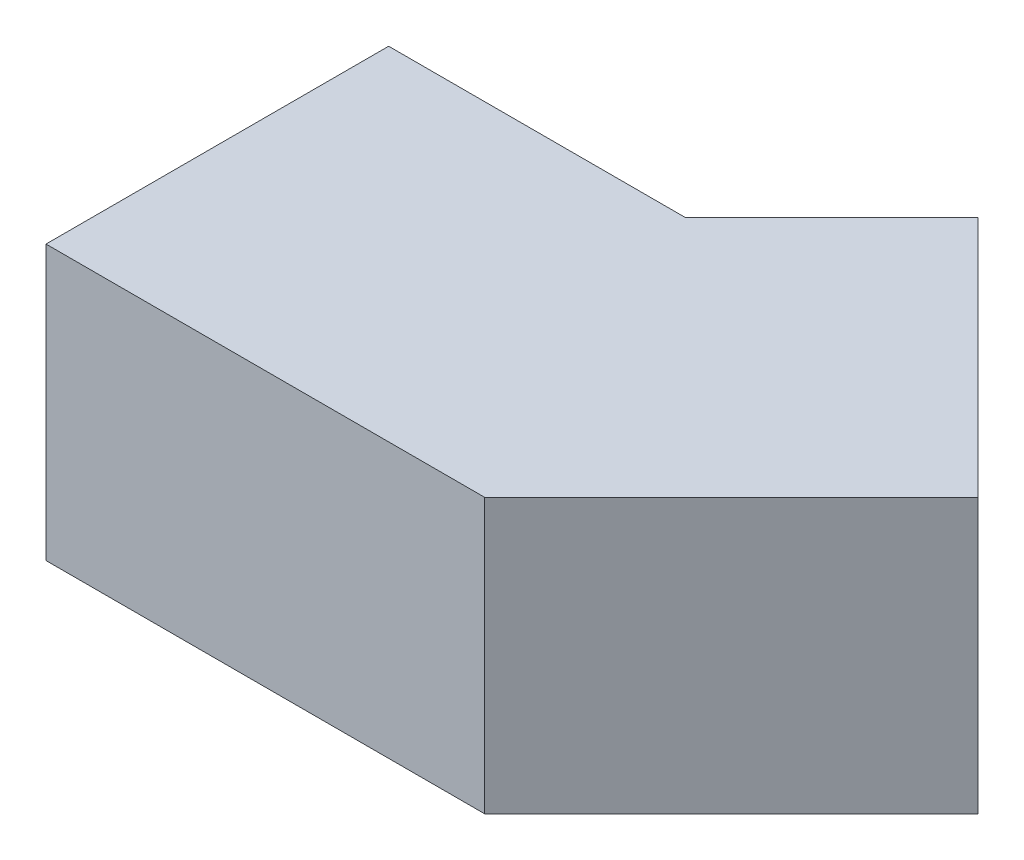
ISO-10303-21;
HEADER;
FILE_DESCRIPTION(('STEP AP214'),'2;1');
FILE_NAME('part.step','',(''),(''),'','','');
FILE_SCHEMA(('AUTOMOTIVE_DESIGN { 1 0 10303 214 1 1 1 1 }'));
ENDSEC;
DATA;
#1=APPLICATION_CONTEXT('core data for automotive mechanical design processes');
#2=APPLICATION_PROTOCOL_DEFINITION('international standard','automotive_design',2000,#1);
#3=PRODUCT_CONTEXT('',#1,'mechanical');
#4=PRODUCT('Part','Part','',(#3));
#5=PRODUCT_RELATED_PRODUCT_CATEGORY('part','',(#4));
#6=PRODUCT_DEFINITION_FORMATION('','',#4);
#7=PRODUCT_DEFINITION_CONTEXT('part definition',#1,'design');
#8=PRODUCT_DEFINITION('design','',#6,#7);
#9=PRODUCT_DEFINITION_SHAPE('','',#8);
#10=(LENGTH_UNIT() NAMED_UNIT(*) SI_UNIT(.MILLI.,.METRE.));
#11=(NAMED_UNIT(*) PLANE_ANGLE_UNIT() SI_UNIT($,.RADIAN.));
#12=(NAMED_UNIT(*) SI_UNIT($,.STERADIAN.) SOLID_ANGLE_UNIT());
#13=UNCERTAINTY_MEASURE_WITH_UNIT(LENGTH_MEASURE(1.E-05),#10,'distance_accuracy_value','');
#14=(GEOMETRIC_REPRESENTATION_CONTEXT(3) GLOBAL_UNCERTAINTY_ASSIGNED_CONTEXT((#13)) GLOBAL_UNIT_ASSIGNED_CONTEXT((#10,
#11,#12)) REPRESENTATION_CONTEXT('',''));
#15=CARTESIAN_POINT('',(0.,0.,0.));
#16=DIRECTION('',(0.,0.,1.));
#17=DIRECTION('',(1.,0.,0.));
#18=AXIS2_PLACEMENT_3D('',#15,#16,#17);
#19=CARTESIAN_POINT('',(0.,20.,-25.));
#20=DIRECTION('',(1.,0.,0.));
#21=DIRECTION('',(0.,0.,-1.));
#22=AXIS2_PLACEMENT_3D('',#19,#20,#21);
#23=PLANE('',#22);
#24=DIRECTION('',(0.,0.,1.));
#25=VECTOR('',#24,1.);
#26=CARTESIAN_POINT('',(0.,0.,-25.));
#27=LINE('',#26,#25);
#28=CARTESIAN_POINT('',(0.,0.,-25.));
#29=VERTEX_POINT('',#28);
#30=CARTESIAN_POINT('',(0.,0.,0.));
#31=VERTEX_POINT('',#30);
#32=EDGE_CURVE('E128',#29,#31,#27,.T.);
#33=ORIENTED_EDGE('',*,*,#32,.T.);
#34=DIRECTION('',(0.,-1.,0.));
#35=VECTOR('',#34,1.);
#36=CARTESIAN_POINT('',(0.,20.,0.));
#37=LINE('',#36,#35);
#38=CARTESIAN_POINT('',(0.,20.,0.));
#39=VERTEX_POINT('',#38);
#40=EDGE_CURVE('E11',#39,#31,#37,.T.);
#41=ORIENTED_EDGE('',*,*,#40,.F.);
#42=DIRECTION('',(0.,0.,1.));
#43=VECTOR('',#42,1.);
#44=CARTESIAN_POINT('',(0.,20.,-25.));
#45=LINE('',#44,#43);
#46=CARTESIAN_POINT('',(0.,20.,-25.));
#47=VERTEX_POINT('',#46);
#48=EDGE_CURVE('E144',#47,#39,#45,.T.);
#49=ORIENTED_EDGE('',*,*,#48,.F.);
#50=DIRECTION('',(0.,-1.,0.));
#51=VECTOR('',#50,1.);
#52=CARTESIAN_POINT('',(0.,20.,-25.));
#53=LINE('',#52,#51);
#54=EDGE_CURVE('E124',#47,#29,#53,.T.);
#55=ORIENTED_EDGE('',*,*,#54,.T.);
#56=EDGE_LOOP('',(#33,#41,#49,#55));
#57=FACE_BOUND('',#56,.T.);
#58=ADVANCED_FACE('F39',(#57),#23,.F.);
#59=CARTESIAN_POINT('',(0.,20.,0.));
#60=DIRECTION('',(0.,0.,-1.));
#61=DIRECTION('',(-1.,0.,0.));
#62=AXIS2_PLACEMENT_3D('',#59,#60,#61);
#63=PLANE('',#62);
#64=DIRECTION('',(1.,0.,0.));
#65=VECTOR('',#64,1.);
#66=CARTESIAN_POINT('',(0.,0.,0.));
#67=LINE('',#66,#65);
#68=CARTESIAN_POINT('',(32.,0.,0.));
#69=VERTEX_POINT('',#68);
#70=EDGE_CURVE('E132',#31,#69,#67,.T.);
#71=ORIENTED_EDGE('',*,*,#70,.T.);
#72=DIRECTION('',(0.,-1.,0.));
#73=VECTOR('',#72,1.);
#74=CARTESIAN_POINT('',(32.,20.,0.));
#75=LINE('',#74,#73);
#76=CARTESIAN_POINT('',(32.,20.,0.));
#77=VERTEX_POINT('',#76);
#78=EDGE_CURVE('E48',#77,#69,#75,.T.);
#79=ORIENTED_EDGE('',*,*,#78,.F.);
#80=DIRECTION('',(1.,0.,0.));
#81=VECTOR('',#80,1.);
#82=CARTESIAN_POINT('',(0.,20.,0.));
#83=LINE('',#82,#81);
#84=EDGE_CURVE('E93',#39,#77,#83,.T.);
#85=ORIENTED_EDGE('',*,*,#84,.F.);
#86=ORIENTED_EDGE('',*,*,#40,.T.);
#87=EDGE_LOOP('',(#71,#79,#85,#86));
#88=FACE_BOUND('',#87,.T.);
#89=ADVANCED_FACE('F172',(#88),#63,.F.);
#90=CARTESIAN_POINT('',(32.,20.,0.));
#91=DIRECTION('',(-0.707106781186549,0.,-0.707106781186546));
#92=DIRECTION('',(-0.707106781186546,0.,0.707106781186549));
#93=AXIS2_PLACEMENT_3D('',#90,#91,#92);
#94=PLANE('',#93);
#95=DIRECTION('',(0.707106781186546,0.,-0.707106781186549));
#96=VECTOR('',#95,1.);
#97=CARTESIAN_POINT('',(32.,0.,0.));
#98=LINE('',#97,#96);
#99=CARTESIAN_POINT('',(50.,0.,-18.0000000000001));
#100=VERTEX_POINT('',#99);
#101=EDGE_CURVE('E135',#69,#100,#98,.T.);
#102=ORIENTED_EDGE('',*,*,#101,.T.);
#103=DIRECTION('',(0.,-1.,0.));
#104=VECTOR('',#103,1.);
#105=CARTESIAN_POINT('',(50.,20.,-18.0000000000001));
#106=LINE('',#105,#104);
#107=CARTESIAN_POINT('',(50.,20.,-18.0000000000001));
#108=VERTEX_POINT('',#107);
#109=EDGE_CURVE('E117',#108,#100,#106,.T.);
#110=ORIENTED_EDGE('',*,*,#109,.F.);
#111=DIRECTION('',(0.707106781186546,0.,-0.707106781186549));
#112=VECTOR('',#111,1.);
#113=CARTESIAN_POINT('',(32.,20.,0.));
#114=LINE('',#113,#112);
#115=EDGE_CURVE('E106',#77,#108,#114,.T.);
#116=ORIENTED_EDGE('',*,*,#115,.F.);
#117=ORIENTED_EDGE('',*,*,#78,.T.);
#118=EDGE_LOOP('',(#102,#110,#116,#117));
#119=FACE_BOUND('',#118,.T.);
#120=ADVANCED_FACE('F154',(#119),#94,.F.);
#121=CARTESIAN_POINT('',(50.,20.,-18.0000000000001));
#122=DIRECTION('',(-0.707106781186546,0.,0.707106781186549));
#123=DIRECTION('',(0.707106781186549,0.,0.707106781186546));
#124=AXIS2_PLACEMENT_3D('',#121,#122,#123);
#125=PLANE('',#124);
#126=DIRECTION('',(-0.707106781186549,0.,-0.707106781186546));
#127=VECTOR('',#126,1.);
#128=CARTESIAN_POINT('',(50.,0.,-18.0000000000001));
#129=LINE('',#128,#127);
#130=CARTESIAN_POINT('',(32.3223304703363,0.,-35.6776695296637));
#131=VERTEX_POINT('',#130);
#132=EDGE_CURVE('E115',#100,#131,#129,.T.);
#133=ORIENTED_EDGE('',*,*,#132,.T.);
#134=DIRECTION('',(0.,-1.,0.));
#135=VECTOR('',#134,1.);
#136=CARTESIAN_POINT('',(32.3223304703363,20.,-35.6776695296637));
#137=LINE('',#136,#135);
#138=CARTESIAN_POINT('',(32.3223304703363,20.,-35.6776695296637));
#139=VERTEX_POINT('',#138);
#140=EDGE_CURVE('E112',#139,#131,#137,.T.);
#141=ORIENTED_EDGE('',*,*,#140,.F.);
#142=DIRECTION('',(-0.707106781186549,0.,-0.707106781186546));
#143=VECTOR('',#142,1.);
#144=CARTESIAN_POINT('',(50.,20.,-18.0000000000001));
#145=LINE('',#144,#143);
#146=EDGE_CURVE('E100',#108,#139,#145,.T.);
#147=ORIENTED_EDGE('',*,*,#146,.F.);
#148=ORIENTED_EDGE('',*,*,#109,.T.);
#149=EDGE_LOOP('',(#133,#141,#147,#148));
#150=FACE_BOUND('',#149,.T.);
#151=ADVANCED_FACE('F113',(#150),#125,.F.);
#152=CARTESIAN_POINT('',(32.3223304703363,20.,-35.6776695296637));
#153=DIRECTION('',(0.707106781186549,0.,0.707106781186546));
#154=DIRECTION('',(0.707106781186546,0.,-0.707106781186549));
#155=AXIS2_PLACEMENT_3D('',#152,#153,#154);
#156=PLANE('',#155);
#157=DIRECTION('',(-0.707106781186546,0.,0.707106781186549));
#158=VECTOR('',#157,1.);
#159=CARTESIAN_POINT('',(32.3223304703363,0.,-35.6776695296637));
#160=LINE('',#159,#158);
#161=CARTESIAN_POINT('',(21.6446609406726,0.,-25.));
#162=VERTEX_POINT('',#161);
#163=EDGE_CURVE('E79',#131,#162,#160,.T.);
#164=ORIENTED_EDGE('',*,*,#163,.T.);
#165=DIRECTION('',(0.,-1.,0.));
#166=VECTOR('',#165,1.);
#167=CARTESIAN_POINT('',(21.6446609406726,20.,-25.));
#168=LINE('',#167,#166);
#169=CARTESIAN_POINT('',(21.6446609406726,20.,-25.));
#170=VERTEX_POINT('',#169);
#171=EDGE_CURVE('E118',#170,#162,#168,.T.);
#172=ORIENTED_EDGE('',*,*,#171,.F.);
#173=DIRECTION('',(-0.707106781186546,0.,0.707106781186549));
#174=VECTOR('',#173,1.);
#175=CARTESIAN_POINT('',(32.3223304703363,20.,-35.6776695296637));
#176=LINE('',#175,#174);
#177=EDGE_CURVE('E104',#139,#170,#176,.T.);
#178=ORIENTED_EDGE('',*,*,#177,.F.);
#179=ORIENTED_EDGE('',*,*,#140,.T.);
#180=EDGE_LOOP('',(#164,#172,#178,#179));
#181=FACE_BOUND('',#180,.T.);
#182=ADVANCED_FACE('F120',(#181),#156,.F.);
#183=CARTESIAN_POINT('',(21.6446609406726,20.,-25.));
#184=DIRECTION('',(0.,0.,1.));
#185=DIRECTION('',(1.,0.,0.));
#186=AXIS2_PLACEMENT_3D('',#183,#184,#185);
#187=PLANE('',#186);
#188=DIRECTION('',(-1.,0.,0.));
#189=VECTOR('',#188,1.);
#190=CARTESIAN_POINT('',(21.6446609406726,0.,-25.));
#191=LINE('',#190,#189);
#192=EDGE_CURVE('E85',#162,#29,#191,.T.);
#193=ORIENTED_EDGE('',*,*,#192,.T.);
#194=ORIENTED_EDGE('',*,*,#54,.F.);
#195=DIRECTION('',(-1.,0.,0.));
#196=VECTOR('',#195,1.);
#197=CARTESIAN_POINT('',(21.6446609406726,20.,-25.));
#198=LINE('',#197,#196);
#199=EDGE_CURVE('E56',#170,#47,#198,.T.);
#200=ORIENTED_EDGE('',*,*,#199,.F.);
#201=ORIENTED_EDGE('',*,*,#171,.T.);
#202=EDGE_LOOP('',(#193,#194,#200,#201));
#203=FACE_BOUND('',#202,.T.);
#204=ADVANCED_FACE('F161',(#203),#187,.F.);
#205=CARTESIAN_POINT('',(0.,20.,0.));
#206=DIRECTION('',(0.,1.,0.));
#207=DIRECTION('',(0.,0.,1.));
#208=AXIS2_PLACEMENT_3D('',#205,#206,#207);
#209=PLANE('',#208);
#210=ORIENTED_EDGE('',*,*,#48,.T.);
#211=ORIENTED_EDGE('',*,*,#84,.T.);
#212=ORIENTED_EDGE('',*,*,#115,.T.);
#213=ORIENTED_EDGE('',*,*,#146,.T.);
#214=ORIENTED_EDGE('',*,*,#177,.T.);
#215=ORIENTED_EDGE('',*,*,#199,.T.);
#216=EDGE_LOOP('',(#210,#211,#212,#213,#214,#215));
#217=FACE_BOUND('',#216,.T.);
#218=ADVANCED_FACE('F102',(#217),#209,.T.);
#219=CARTESIAN_POINT('',(0.,0.,0.));
#220=DIRECTION('',(0.,1.,0.));
#221=DIRECTION('',(0.,0.,1.));
#222=AXIS2_PLACEMENT_3D('',#219,#220,#221);
#223=PLANE('',#222);
#224=ORIENTED_EDGE('',*,*,#32,.F.);
#225=ORIENTED_EDGE('',*,*,#192,.F.);
#226=ORIENTED_EDGE('',*,*,#163,.F.);
#227=ORIENTED_EDGE('',*,*,#132,.F.);
#228=ORIENTED_EDGE('',*,*,#101,.F.);
#229=ORIENTED_EDGE('',*,*,#70,.F.);
#230=EDGE_LOOP('',(#224,#225,#226,#227,#228,#229));
#231=FACE_BOUND('',#230,.T.);
#232=ADVANCED_FACE('F157',(#231),#223,.F.);
#233=CLOSED_SHELL('',(#58,#89,#120,#151,#182,#204,#218,#232));
#234=MANIFOLD_SOLID_BREP('B2',#233);
#235=ADVANCED_BREP_SHAPE_REPRESENTATION('',(#18,#234),#14);
#236=SHAPE_DEFINITION_REPRESENTATION(#9,#235);
ENDSEC;
END-ISO-10303-21;
